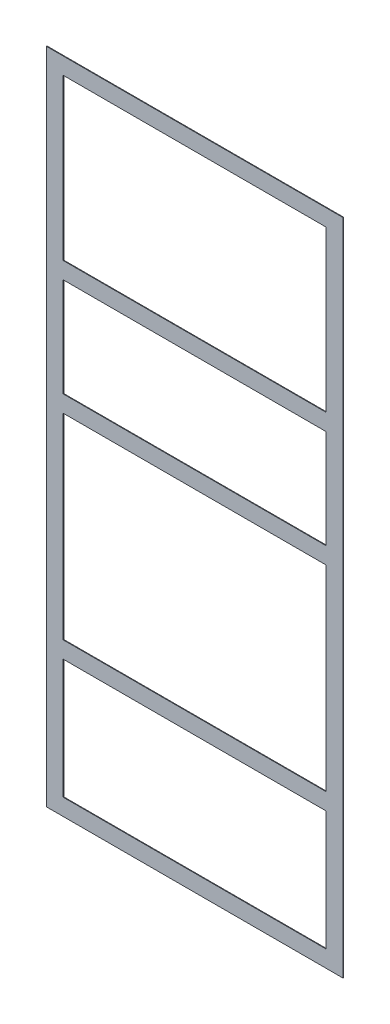
ISO-10303-21;
HEADER;
FILE_DESCRIPTION(('STEP AP214'),'2;1');
FILE_NAME('part.step','',(''),(''),'','','');
FILE_SCHEMA(('AUTOMOTIVE_DESIGN { 1 0 10303 214 1 1 1 1 }'));
ENDSEC;
DATA;
#1=APPLICATION_CONTEXT('core data for automotive mechanical design processes');
#2=APPLICATION_PROTOCOL_DEFINITION('international standard','automotive_design',2000,#1);
#3=PRODUCT_CONTEXT('',#1,'mechanical');
#4=PRODUCT('Part','Part','',(#3));
#5=PRODUCT_RELATED_PRODUCT_CATEGORY('part','',(#4));
#6=PRODUCT_DEFINITION_FORMATION('','',#4);
#7=PRODUCT_DEFINITION_CONTEXT('part definition',#1,'design');
#8=PRODUCT_DEFINITION('design','',#6,#7);
#9=PRODUCT_DEFINITION_SHAPE('','',#8);
#10=(LENGTH_UNIT() NAMED_UNIT(*) SI_UNIT(.MILLI.,.METRE.));
#11=(NAMED_UNIT(*) PLANE_ANGLE_UNIT() SI_UNIT($,.RADIAN.));
#12=(NAMED_UNIT(*) SI_UNIT($,.STERADIAN.) SOLID_ANGLE_UNIT());
#13=UNCERTAINTY_MEASURE_WITH_UNIT(LENGTH_MEASURE(1.E-05),#10,'distance_accuracy_value','');
#14=(GEOMETRIC_REPRESENTATION_CONTEXT(3) GLOBAL_UNCERTAINTY_ASSIGNED_CONTEXT((#13)) GLOBAL_UNIT_ASSIGNED_CONTEXT((#10,
#11,#12)) REPRESENTATION_CONTEXT('',''));
#15=CARTESIAN_POINT('',(0.,0.,0.));
#16=DIRECTION('',(0.,0.,1.));
#17=DIRECTION('',(1.,0.,0.));
#18=AXIS2_PLACEMENT_3D('',#15,#16,#17);
#19=CARTESIAN_POINT('',(0.,0.,1.9));
#20=DIRECTION('',(0.,0.,1.));
#21=DIRECTION('',(1.,0.,0.));
#22=AXIS2_PLACEMENT_3D('',#19,#20,#21);
#23=PLANE('',#22);
#24=DIRECTION('',(0.,-1.,0.));
#25=VECTOR('',#24,1.);
#26=CARTESIAN_POINT('',(-399.2,0.,1.9));
#27=LINE('',#26,#25);
#28=CARTESIAN_POINT('',(-399.2,60.5999999999998,1.9));
#29=VERTEX_POINT('',#28);
#30=CARTESIAN_POINT('',(-399.2,-535.4,1.9));
#31=VERTEX_POINT('',#30);
#32=EDGE_CURVE('E53',#29,#31,#27,.T.);
#33=ORIENTED_EDGE('',*,*,#32,.F.);
#34=DIRECTION('',(1.,0.,0.));
#35=VECTOR('',#34,1.);
#36=CARTESIAN_POINT('',(0.,60.5999999999998,1.9));
#37=LINE('',#36,#35);
#38=CARTESIAN_POINT('',(399.2,60.5999999999998,1.9));
#39=VERTEX_POINT('',#38);
#40=EDGE_CURVE('E195',#29,#39,#37,.T.);
#41=ORIENTED_EDGE('',*,*,#40,.T.);
#42=DIRECTION('',(0.,-1.,0.));
#43=VECTOR('',#42,1.);
#44=CARTESIAN_POINT('',(399.2,0.,1.9));
#45=LINE('',#44,#43);
#46=CARTESIAN_POINT('',(399.2,-535.4,1.9));
#47=VERTEX_POINT('',#46);
#48=EDGE_CURVE('E198',#39,#47,#45,.T.);
#49=ORIENTED_EDGE('',*,*,#48,.T.);
#50=DIRECTION('',(1.,0.,0.));
#51=VECTOR('',#50,1.);
#52=CARTESIAN_POINT('',(0.,-535.4,1.9));
#53=LINE('',#52,#51);
#54=EDGE_CURVE('E204',#31,#47,#53,.T.);
#55=ORIENTED_EDGE('',*,*,#54,.F.);
#56=EDGE_LOOP('',(#33,#41,#49,#55));
#57=FACE_BOUND('',#56,.T.);
#58=DIRECTION('',(0.,-1.,0.));
#59=VECTOR('',#58,1.);
#60=CARTESIAN_POINT('',(-399.2,0.,1.9));
#61=LINE('',#60,#59);
#62=CARTESIAN_POINT('',(-399.2,411.4,1.9));
#63=VERTEX_POINT('',#62);
#64=CARTESIAN_POINT('',(-399.2,111.4,1.9));
#65=VERTEX_POINT('',#64);
#66=EDGE_CURVE('E61',#63,#65,#61,.T.);
#67=ORIENTED_EDGE('',*,*,#66,.F.);
#68=DIRECTION('',(1.,0.,0.));
#69=VECTOR('',#68,1.);
#70=CARTESIAN_POINT('',(0.,411.4,1.9));
#71=LINE('',#70,#69);
#72=CARTESIAN_POINT('',(399.2,411.4,1.9));
#73=VERTEX_POINT('',#72);
#74=EDGE_CURVE('E219',#63,#73,#71,.T.);
#75=ORIENTED_EDGE('',*,*,#74,.T.);
#76=DIRECTION('',(0.,-1.,0.));
#77=VECTOR('',#76,1.);
#78=CARTESIAN_POINT('',(399.2,0.,1.9));
#79=LINE('',#78,#77);
#80=CARTESIAN_POINT('',(399.2,111.4,1.9));
#81=VERTEX_POINT('',#80);
#82=EDGE_CURVE('E233',#73,#81,#79,.T.);
#83=ORIENTED_EDGE('',*,*,#82,.T.);
#84=DIRECTION('',(1.,0.,0.));
#85=VECTOR('',#84,1.);
#86=CARTESIAN_POINT('',(0.,111.4,1.9));
#87=LINE('',#86,#85);
#88=EDGE_CURVE('E229',#65,#81,#87,.T.);
#89=ORIENTED_EDGE('',*,*,#88,.F.);
#90=EDGE_LOOP('',(#67,#75,#83,#89));
#91=FACE_BOUND('',#90,.T.);
#92=DIRECTION('',(0.,-1.,0.));
#93=VECTOR('',#92,1.);
#94=CARTESIAN_POINT('',(-399.2,0.,1.9));
#95=LINE('',#94,#93);
#96=CARTESIAN_POINT('',(-399.2,949.2,1.9));
#97=VERTEX_POINT('',#96);
#98=CARTESIAN_POINT('',(-399.2,462.2,1.9));
#99=VERTEX_POINT('',#98);
#100=EDGE_CURVE('E257',#97,#99,#95,.T.);
#101=ORIENTED_EDGE('',*,*,#100,.F.);
#102=DIRECTION('',(1.,0.,0.));
#103=VECTOR('',#102,1.);
#104=CARTESIAN_POINT('',(0.,949.2,1.9));
#105=LINE('',#104,#103);
#106=CARTESIAN_POINT('',(399.2,949.2,1.9));
#107=VERTEX_POINT('',#106);
#108=EDGE_CURVE('E248',#97,#107,#105,.T.);
#109=ORIENTED_EDGE('',*,*,#108,.T.);
#110=DIRECTION('',(0.,-1.,0.));
#111=VECTOR('',#110,1.);
#112=CARTESIAN_POINT('',(399.2,0.,1.9));
#113=LINE('',#112,#111);
#114=CARTESIAN_POINT('',(399.2,462.2,1.9));
#115=VERTEX_POINT('',#114);
#116=EDGE_CURVE('E262',#107,#115,#113,.T.);
#117=ORIENTED_EDGE('',*,*,#116,.T.);
#118=DIRECTION('',(1.,0.,0.));
#119=VECTOR('',#118,1.);
#120=CARTESIAN_POINT('',(0.,462.2,1.9));
#121=LINE('',#120,#119);
#122=EDGE_CURVE('E259',#99,#115,#121,.T.);
#123=ORIENTED_EDGE('',*,*,#122,.F.);
#124=EDGE_LOOP('',(#101,#109,#117,#123));
#125=FACE_BOUND('',#124,.T.);
#126=DIRECTION('',(0.,1.,0.));
#127=VECTOR('',#126,1.);
#128=CARTESIAN_POINT('',(450.,1000.,1.9));
#129=LINE('',#128,#127);
#130=CARTESIAN_POINT('',(450.,-1000.,1.9));
#131=VERTEX_POINT('',#130);
#132=CARTESIAN_POINT('',(450.,1000.,1.9));
#133=VERTEX_POINT('',#132);
#134=EDGE_CURVE('E306',#131,#133,#129,.T.);
#135=ORIENTED_EDGE('',*,*,#134,.T.);
#136=DIRECTION('',(-1.,0.,0.));
#137=VECTOR('',#136,1.);
#138=CARTESIAN_POINT('',(-450.,1000.,1.9));
#139=LINE('',#138,#137);
#140=CARTESIAN_POINT('',(-450.,1000.,1.9));
#141=VERTEX_POINT('',#140);
#142=EDGE_CURVE('E309',#133,#141,#139,.T.);
#143=ORIENTED_EDGE('',*,*,#142,.T.);
#144=DIRECTION('',(0.,-1.,0.));
#145=VECTOR('',#144,1.);
#146=CARTESIAN_POINT('',(-450.,1000.,1.9));
#147=LINE('',#146,#145);
#148=CARTESIAN_POINT('',(-450.,-1000.,1.9));
#149=VERTEX_POINT('',#148);
#150=EDGE_CURVE('E312',#141,#149,#147,.T.);
#151=ORIENTED_EDGE('',*,*,#150,.T.);
#152=DIRECTION('',(1.,0.,0.));
#153=VECTOR('',#152,1.);
#154=CARTESIAN_POINT('',(-450.,-1000.,1.9));
#155=LINE('',#154,#153);
#156=EDGE_CURVE('E314',#149,#131,#155,.T.);
#157=ORIENTED_EDGE('',*,*,#156,.T.);
#158=EDGE_LOOP('',(#135,#143,#151,#157));
#159=FACE_BOUND('',#158,.T.);
#160=DIRECTION('',(0.,-1.,0.));
#161=VECTOR('',#160,1.);
#162=CARTESIAN_POINT('',(-399.2,0.,1.9));
#163=LINE('',#162,#161);
#164=CARTESIAN_POINT('',(-399.2,-586.2,1.9));
#165=VERTEX_POINT('',#164);
#166=CARTESIAN_POINT('',(-399.2,-949.2,1.9));
#167=VERTEX_POINT('',#166);
#168=EDGE_CURVE('E288',#165,#167,#163,.T.);
#169=ORIENTED_EDGE('',*,*,#168,.F.);
#170=DIRECTION('',(1.,0.,0.));
#171=VECTOR('',#170,1.);
#172=CARTESIAN_POINT('',(0.,-586.2,1.9));
#173=LINE('',#172,#171);
#174=CARTESIAN_POINT('',(399.2,-586.2,1.9));
#175=VERTEX_POINT('',#174);
#176=EDGE_CURVE('E211',#165,#175,#173,.T.);
#177=ORIENTED_EDGE('',*,*,#176,.T.);
#178=DIRECTION('',(0.,-1.,0.));
#179=VECTOR('',#178,1.);
#180=CARTESIAN_POINT('',(399.2,0.,1.9));
#181=LINE('',#180,#179);
#182=CARTESIAN_POINT('',(399.2,-949.2,1.9));
#183=VERTEX_POINT('',#182);
#184=EDGE_CURVE('E277',#175,#183,#181,.T.);
#185=ORIENTED_EDGE('',*,*,#184,.T.);
#186=DIRECTION('',(1.,0.,0.));
#187=VECTOR('',#186,1.);
#188=CARTESIAN_POINT('',(0.,-949.2,1.9));
#189=LINE('',#188,#187);
#190=EDGE_CURVE('E291',#167,#183,#189,.T.);
#191=ORIENTED_EDGE('',*,*,#190,.F.);
#192=EDGE_LOOP('',(#169,#177,#185,#191));
#193=FACE_BOUND('',#192,.T.);
#194=ADVANCED_FACE('F38',(#57,#91,#125,#159,#193),#23,.T.);
#195=CARTESIAN_POINT('',(0.,0.,0.));
#196=DIRECTION('',(0.,0.,1.));
#197=DIRECTION('',(1.,0.,0.));
#198=AXIS2_PLACEMENT_3D('',#195,#196,#197);
#199=PLANE('',#198);
#200=DIRECTION('',(1.,0.,0.));
#201=VECTOR('',#200,1.);
#202=CARTESIAN_POINT('',(0.,60.5999999999998,0.));
#203=LINE('',#202,#201);
#204=CARTESIAN_POINT('',(-399.2,60.5999999999998,0.));
#205=VERTEX_POINT('',#204);
#206=CARTESIAN_POINT('',(399.2,60.5999999999998,0.));
#207=VERTEX_POINT('',#206);
#208=EDGE_CURVE('E183',#205,#207,#203,.T.);
#209=ORIENTED_EDGE('',*,*,#208,.F.);
#210=DIRECTION('',(0.,-1.,0.));
#211=VECTOR('',#210,1.);
#212=CARTESIAN_POINT('',(-399.2,0.,0.));
#213=LINE('',#212,#211);
#214=CARTESIAN_POINT('',(-399.2,-535.4,0.));
#215=VERTEX_POINT('',#214);
#216=EDGE_CURVE('E177',#205,#215,#213,.T.);
#217=ORIENTED_EDGE('',*,*,#216,.T.);
#218=DIRECTION('',(1.,0.,0.));
#219=VECTOR('',#218,1.);
#220=CARTESIAN_POINT('',(0.,-535.4,0.));
#221=LINE('',#220,#219);
#222=CARTESIAN_POINT('',(399.2,-535.4,0.));
#223=VERTEX_POINT('',#222);
#224=EDGE_CURVE('E186',#215,#223,#221,.T.);
#225=ORIENTED_EDGE('',*,*,#224,.T.);
#226=DIRECTION('',(0.,-1.,0.));
#227=VECTOR('',#226,1.);
#228=CARTESIAN_POINT('',(399.2,0.,0.));
#229=LINE('',#228,#227);
#230=EDGE_CURVE('E191',#207,#223,#229,.T.);
#231=ORIENTED_EDGE('',*,*,#230,.F.);
#232=EDGE_LOOP('',(#209,#217,#225,#231));
#233=FACE_BOUND('',#232,.T.);
#234=DIRECTION('',(1.,0.,0.));
#235=VECTOR('',#234,1.);
#236=CARTESIAN_POINT('',(0.,411.4,0.));
#237=LINE('',#236,#235);
#238=CARTESIAN_POINT('',(-399.2,411.4,0.));
#239=VERTEX_POINT('',#238);
#240=CARTESIAN_POINT('',(399.2,411.4,0.));
#241=VERTEX_POINT('',#240);
#242=EDGE_CURVE('E225',#239,#241,#237,.T.);
#243=ORIENTED_EDGE('',*,*,#242,.F.);
#244=DIRECTION('',(0.,-1.,0.));
#245=VECTOR('',#244,1.);
#246=CARTESIAN_POINT('',(-399.2,0.,0.));
#247=LINE('',#246,#245);
#248=CARTESIAN_POINT('',(-399.2,111.4,0.));
#249=VERTEX_POINT('',#248);
#250=EDGE_CURVE('E215',#239,#249,#247,.T.);
#251=ORIENTED_EDGE('',*,*,#250,.T.);
#252=DIRECTION('',(1.,0.,0.));
#253=VECTOR('',#252,1.);
#254=CARTESIAN_POINT('',(0.,111.4,0.));
#255=LINE('',#254,#253);
#256=CARTESIAN_POINT('',(399.2,111.4,0.));
#257=VERTEX_POINT('',#256);
#258=EDGE_CURVE('E218',#249,#257,#255,.T.);
#259=ORIENTED_EDGE('',*,*,#258,.T.);
#260=DIRECTION('',(0.,-1.,0.));
#261=VECTOR('',#260,1.);
#262=CARTESIAN_POINT('',(399.2,0.,0.));
#263=LINE('',#262,#261);
#264=EDGE_CURVE('E222',#241,#257,#263,.T.);
#265=ORIENTED_EDGE('',*,*,#264,.F.);
#266=EDGE_LOOP('',(#243,#251,#259,#265));
#267=FACE_BOUND('',#266,.T.);
#268=DIRECTION('',(1.,0.,0.));
#269=VECTOR('',#268,1.);
#270=CARTESIAN_POINT('',(0.,949.2,0.));
#271=LINE('',#270,#269);
#272=CARTESIAN_POINT('',(-399.2,949.2,0.));
#273=VERTEX_POINT('',#272);
#274=CARTESIAN_POINT('',(399.2,949.2,0.));
#275=VERTEX_POINT('',#274);
#276=EDGE_CURVE('E254',#273,#275,#271,.T.);
#277=ORIENTED_EDGE('',*,*,#276,.F.);
#278=DIRECTION('',(0.,-1.,0.));
#279=VECTOR('',#278,1.);
#280=CARTESIAN_POINT('',(-399.2,0.,0.));
#281=LINE('',#280,#279);
#282=CARTESIAN_POINT('',(-399.2,462.2,0.));
#283=VERTEX_POINT('',#282);
#284=EDGE_CURVE('E244',#273,#283,#281,.T.);
#285=ORIENTED_EDGE('',*,*,#284,.T.);
#286=DIRECTION('',(1.,0.,0.));
#287=VECTOR('',#286,1.);
#288=CARTESIAN_POINT('',(0.,462.2,0.));
#289=LINE('',#288,#287);
#290=CARTESIAN_POINT('',(399.2,462.2,0.));
#291=VERTEX_POINT('',#290);
#292=EDGE_CURVE('E247',#283,#291,#289,.T.);
#293=ORIENTED_EDGE('',*,*,#292,.T.);
#294=DIRECTION('',(0.,-1.,0.));
#295=VECTOR('',#294,1.);
#296=CARTESIAN_POINT('',(399.2,0.,0.));
#297=LINE('',#296,#295);
#298=EDGE_CURVE('E251',#275,#291,#297,.T.);
#299=ORIENTED_EDGE('',*,*,#298,.F.);
#300=EDGE_LOOP('',(#277,#285,#293,#299));
#301=FACE_BOUND('',#300,.T.);
#302=DIRECTION('',(0.,1.,0.));
#303=VECTOR('',#302,1.);
#304=CARTESIAN_POINT('',(450.,1000.,0.));
#305=LINE('',#304,#303);
#306=CARTESIAN_POINT('',(450.,-1000.,0.));
#307=VERTEX_POINT('',#306);
#308=CARTESIAN_POINT('',(450.,1000.,0.));
#309=VERTEX_POINT('',#308);
#310=EDGE_CURVE('E299',#307,#309,#305,.T.);
#311=ORIENTED_EDGE('',*,*,#310,.F.);
#312=DIRECTION('',(1.,0.,0.));
#313=VECTOR('',#312,1.);
#314=CARTESIAN_POINT('',(-450.,-1000.,0.));
#315=LINE('',#314,#313);
#316=CARTESIAN_POINT('',(-450.,-1000.,0.));
#317=VERTEX_POINT('',#316);
#318=EDGE_CURVE('E310',#317,#307,#315,.T.);
#319=ORIENTED_EDGE('',*,*,#318,.F.);
#320=DIRECTION('',(0.,-1.,0.));
#321=VECTOR('',#320,1.);
#322=CARTESIAN_POINT('',(-450.,1000.,0.));
#323=LINE('',#322,#321);
#324=CARTESIAN_POINT('',(-450.,1000.,0.));
#325=VERTEX_POINT('',#324);
#326=EDGE_CURVE('E321',#325,#317,#323,.T.);
#327=ORIENTED_EDGE('',*,*,#326,.F.);
#328=DIRECTION('',(-1.,0.,0.));
#329=VECTOR('',#328,1.);
#330=CARTESIAN_POINT('',(-450.,1000.,0.));
#331=LINE('',#330,#329);
#332=EDGE_CURVE('E319',#309,#325,#331,.T.);
#333=ORIENTED_EDGE('',*,*,#332,.F.);
#334=EDGE_LOOP('',(#311,#319,#327,#333));
#335=FACE_BOUND('',#334,.T.);
#336=DIRECTION('',(1.,0.,0.));
#337=VECTOR('',#336,1.);
#338=CARTESIAN_POINT('',(0.,-586.2,0.));
#339=LINE('',#338,#337);
#340=CARTESIAN_POINT('',(-399.2,-586.2,0.));
#341=VERTEX_POINT('',#340);
#342=CARTESIAN_POINT('',(399.2,-586.2,0.));
#343=VERTEX_POINT('',#342);
#344=EDGE_CURVE('E274',#341,#343,#339,.T.);
#345=ORIENTED_EDGE('',*,*,#344,.F.);
#346=DIRECTION('',(0.,-1.,0.));
#347=VECTOR('',#346,1.);
#348=CARTESIAN_POINT('',(-399.2,0.,0.));
#349=LINE('',#348,#347);
#350=CARTESIAN_POINT('',(-399.2,-949.2,0.));
#351=VERTEX_POINT('',#350);
#352=EDGE_CURVE('E276',#341,#351,#349,.T.);
#353=ORIENTED_EDGE('',*,*,#352,.T.);
#354=DIRECTION('',(1.,0.,0.));
#355=VECTOR('',#354,1.);
#356=CARTESIAN_POINT('',(0.,-949.2,0.));
#357=LINE('',#356,#355);
#358=CARTESIAN_POINT('',(399.2,-949.2,0.));
#359=VERTEX_POINT('',#358);
#360=EDGE_CURVE('E280',#351,#359,#357,.T.);
#361=ORIENTED_EDGE('',*,*,#360,.T.);
#362=DIRECTION('',(0.,-1.,0.));
#363=VECTOR('',#362,1.);
#364=CARTESIAN_POINT('',(399.2,0.,0.));
#365=LINE('',#364,#363);
#366=EDGE_CURVE('E283',#343,#359,#365,.T.);
#367=ORIENTED_EDGE('',*,*,#366,.F.);
#368=EDGE_LOOP('',(#345,#353,#361,#367));
#369=FACE_BOUND('',#368,.T.);
#370=ADVANCED_FACE('F193',(#233,#267,#301,#335,#369),#199,.F.);
#371=CARTESIAN_POINT('',(450.,1000.,1.9));
#372=DIRECTION('',(-1.,0.,0.));
#373=DIRECTION('',(0.,-1.,0.));
#374=AXIS2_PLACEMENT_3D('',#371,#372,#373);
#375=PLANE('',#374);
#376=ORIENTED_EDGE('',*,*,#310,.T.);
#377=DIRECTION('',(0.,0.,-1.));
#378=VECTOR('',#377,1.);
#379=CARTESIAN_POINT('',(450.,1000.,1.9));
#380=LINE('',#379,#378);
#381=EDGE_CURVE('E11',#133,#309,#380,.T.);
#382=ORIENTED_EDGE('',*,*,#381,.F.);
#383=ORIENTED_EDGE('',*,*,#134,.F.);
#384=DIRECTION('',(0.,0.,-1.));
#385=VECTOR('',#384,1.);
#386=CARTESIAN_POINT('',(450.,-1000.,1.9));
#387=LINE('',#386,#385);
#388=EDGE_CURVE('E316',#131,#307,#387,.T.);
#389=ORIENTED_EDGE('',*,*,#388,.T.);
#390=EDGE_LOOP('',(#376,#382,#383,#389));
#391=FACE_BOUND('',#390,.T.);
#392=ADVANCED_FACE('F40',(#391),#375,.F.);
#393=CARTESIAN_POINT('',(-450.,1000.,1.9));
#394=DIRECTION('',(0.,-1.,0.));
#395=DIRECTION('',(0.,0.,-1.));
#396=AXIS2_PLACEMENT_3D('',#393,#394,#395);
#397=PLANE('',#396);
#398=ORIENTED_EDGE('',*,*,#332,.T.);
#399=DIRECTION('',(0.,0.,-1.));
#400=VECTOR('',#399,1.);
#401=CARTESIAN_POINT('',(-450.,1000.,1.9));
#402=LINE('',#401,#400);
#403=EDGE_CURVE('E46',#141,#325,#402,.T.);
#404=ORIENTED_EDGE('',*,*,#403,.F.);
#405=ORIENTED_EDGE('',*,*,#142,.F.);
#406=ORIENTED_EDGE('',*,*,#381,.T.);
#407=EDGE_LOOP('',(#398,#404,#405,#406));
#408=FACE_BOUND('',#407,.T.);
#409=ADVANCED_FACE('F349',(#408),#397,.F.);
#410=CARTESIAN_POINT('',(-450.,1000.,1.9));
#411=DIRECTION('',(1.,0.,0.));
#412=DIRECTION('',(0.,1.,0.));
#413=AXIS2_PLACEMENT_3D('',#410,#411,#412);
#414=PLANE('',#413);
#415=ORIENTED_EDGE('',*,*,#326,.T.);
#416=DIRECTION('',(0.,0.,-1.));
#417=VECTOR('',#416,1.);
#418=CARTESIAN_POINT('',(-450.,-1000.,1.9));
#419=LINE('',#418,#417);
#420=EDGE_CURVE('E326',#149,#317,#419,.T.);
#421=ORIENTED_EDGE('',*,*,#420,.F.);
#422=ORIENTED_EDGE('',*,*,#150,.F.);
#423=ORIENTED_EDGE('',*,*,#403,.T.);
#424=EDGE_LOOP('',(#415,#421,#422,#423));
#425=FACE_BOUND('',#424,.T.);
#426=ADVANCED_FACE('F333',(#425),#414,.F.);
#427=CARTESIAN_POINT('',(-450.,-1000.,1.9));
#428=DIRECTION('',(0.,1.,0.));
#429=DIRECTION('',(0.,0.,1.));
#430=AXIS2_PLACEMENT_3D('',#427,#428,#429);
#431=PLANE('',#430);
#432=ORIENTED_EDGE('',*,*,#318,.T.);
#433=ORIENTED_EDGE('',*,*,#388,.F.);
#434=ORIENTED_EDGE('',*,*,#156,.F.);
#435=ORIENTED_EDGE('',*,*,#420,.T.);
#436=EDGE_LOOP('',(#432,#433,#434,#435));
#437=FACE_BOUND('',#436,.T.);
#438=ADVANCED_FACE('F342',(#437),#431,.F.);
#439=CARTESIAN_POINT('',(0.,-586.2,0.));
#440=DIRECTION('',(0.,-1.,0.));
#441=DIRECTION('',(0.,0.,-1.));
#442=AXIS2_PLACEMENT_3D('',#439,#440,#441);
#443=PLANE('',#442);
#444=ORIENTED_EDGE('',*,*,#176,.F.);
#445=DIRECTION('',(0.,0.,1.));
#446=VECTOR('',#445,1.);
#447=CARTESIAN_POINT('',(-399.2,-586.2,0.));
#448=LINE('',#447,#446);
#449=EDGE_CURVE('E285',#341,#165,#448,.T.);
#450=ORIENTED_EDGE('',*,*,#449,.F.);
#451=ORIENTED_EDGE('',*,*,#344,.T.);
#452=DIRECTION('',(0.,0.,1.));
#453=VECTOR('',#452,1.);
#454=CARTESIAN_POINT('',(399.2,-586.2,0.));
#455=LINE('',#454,#453);
#456=EDGE_CURVE('E296',#343,#175,#455,.T.);
#457=ORIENTED_EDGE('',*,*,#456,.T.);
#458=EDGE_LOOP('',(#444,#450,#451,#457));
#459=FACE_BOUND('',#458,.T.);
#460=ADVANCED_FACE('F365',(#459),#443,.T.);
#461=CARTESIAN_POINT('',(399.2,0.,0.));
#462=DIRECTION('',(-1.,0.,0.));
#463=DIRECTION('',(0.,0.,1.));
#464=AXIS2_PLACEMENT_3D('',#461,#462,#463);
#465=PLANE('',#464);
#466=ORIENTED_EDGE('',*,*,#184,.F.);
#467=ORIENTED_EDGE('',*,*,#456,.F.);
#468=ORIENTED_EDGE('',*,*,#366,.T.);
#469=DIRECTION('',(0.,0.,1.));
#470=VECTOR('',#469,1.);
#471=CARTESIAN_POINT('',(399.2,-949.2,0.));
#472=LINE('',#471,#470);
#473=EDGE_CURVE('E300',#359,#183,#472,.T.);
#474=ORIENTED_EDGE('',*,*,#473,.T.);
#475=EDGE_LOOP('',(#466,#467,#468,#474));
#476=FACE_BOUND('',#475,.T.);
#477=ADVANCED_FACE('F372',(#476),#465,.T.);
#478=CARTESIAN_POINT('',(0.,-949.2,0.));
#479=DIRECTION('',(0.,-1.,0.));
#480=DIRECTION('',(0.,0.,-1.));
#481=AXIS2_PLACEMENT_3D('',#478,#479,#480);
#482=PLANE('',#481);
#483=ORIENTED_EDGE('',*,*,#190,.T.);
#484=ORIENTED_EDGE('',*,*,#473,.F.);
#485=ORIENTED_EDGE('',*,*,#360,.F.);
#486=DIRECTION('',(0.,0.,1.));
#487=VECTOR('',#486,1.);
#488=CARTESIAN_POINT('',(-399.2,-949.2,0.));
#489=LINE('',#488,#487);
#490=EDGE_CURVE('E302',#351,#167,#489,.T.);
#491=ORIENTED_EDGE('',*,*,#490,.T.);
#492=EDGE_LOOP('',(#483,#484,#485,#491));
#493=FACE_BOUND('',#492,.T.);
#494=ADVANCED_FACE('F377',(#493),#482,.F.);
#495=CARTESIAN_POINT('',(-399.2,0.,0.));
#496=DIRECTION('',(-1.,0.,0.));
#497=DIRECTION('',(0.,0.,1.));
#498=AXIS2_PLACEMENT_3D('',#495,#496,#497);
#499=PLANE('',#498);
#500=ORIENTED_EDGE('',*,*,#168,.T.);
#501=ORIENTED_EDGE('',*,*,#490,.F.);
#502=ORIENTED_EDGE('',*,*,#352,.F.);
#503=ORIENTED_EDGE('',*,*,#449,.T.);
#504=EDGE_LOOP('',(#500,#501,#502,#503));
#505=FACE_BOUND('',#504,.T.);
#506=ADVANCED_FACE('F384',(#505),#499,.F.);
#507=CARTESIAN_POINT('',(-399.2,0.,0.));
#508=DIRECTION('',(-1.,0.,0.));
#509=DIRECTION('',(0.,0.,1.));
#510=AXIS2_PLACEMENT_3D('',#507,#508,#509);
#511=PLANE('',#510);
#512=ORIENTED_EDGE('',*,*,#100,.T.);
#513=DIRECTION('',(0.,0.,1.));
#514=VECTOR('',#513,1.);
#515=CARTESIAN_POINT('',(-399.2,462.2,0.));
#516=LINE('',#515,#514);
#517=EDGE_CURVE('E256',#283,#99,#516,.T.);
#518=ORIENTED_EDGE('',*,*,#517,.F.);
#519=ORIENTED_EDGE('',*,*,#284,.F.);
#520=DIRECTION('',(0.,0.,1.));
#521=VECTOR('',#520,1.);
#522=CARTESIAN_POINT('',(-399.2,949.2,0.));
#523=LINE('',#522,#521);
#524=EDGE_CURVE('E230',#273,#97,#523,.T.);
#525=ORIENTED_EDGE('',*,*,#524,.T.);
#526=EDGE_LOOP('',(#512,#518,#519,#525));
#527=FACE_BOUND('',#526,.T.);
#528=ADVANCED_FACE('F396',(#527),#511,.F.);
#529=CARTESIAN_POINT('',(0.,949.2,0.));
#530=DIRECTION('',(0.,-1.,0.));
#531=DIRECTION('',(0.,0.,-1.));
#532=AXIS2_PLACEMENT_3D('',#529,#530,#531);
#533=PLANE('',#532);
#534=ORIENTED_EDGE('',*,*,#108,.F.);
#535=ORIENTED_EDGE('',*,*,#524,.F.);
#536=ORIENTED_EDGE('',*,*,#276,.T.);
#537=DIRECTION('',(0.,0.,1.));
#538=VECTOR('',#537,1.);
#539=CARTESIAN_POINT('',(399.2,949.2,0.));
#540=LINE('',#539,#538);
#541=EDGE_CURVE('E268',#275,#107,#540,.T.);
#542=ORIENTED_EDGE('',*,*,#541,.T.);
#543=EDGE_LOOP('',(#534,#535,#536,#542));
#544=FACE_BOUND('',#543,.T.);
#545=ADVANCED_FACE('F400',(#544),#533,.T.);
#546=CARTESIAN_POINT('',(399.2,0.,0.));
#547=DIRECTION('',(-1.,0.,0.));
#548=DIRECTION('',(0.,0.,1.));
#549=AXIS2_PLACEMENT_3D('',#546,#547,#548);
#550=PLANE('',#549);
#551=ORIENTED_EDGE('',*,*,#116,.F.);
#552=ORIENTED_EDGE('',*,*,#541,.F.);
#553=ORIENTED_EDGE('',*,*,#298,.T.);
#554=DIRECTION('',(0.,0.,1.));
#555=VECTOR('',#554,1.);
#556=CARTESIAN_POINT('',(399.2,462.2,0.));
#557=LINE('',#556,#555);
#558=EDGE_CURVE('E270',#291,#115,#557,.T.);
#559=ORIENTED_EDGE('',*,*,#558,.T.);
#560=EDGE_LOOP('',(#551,#552,#553,#559));
#561=FACE_BOUND('',#560,.T.);
#562=ADVANCED_FACE('F406',(#561),#550,.T.);
#563=CARTESIAN_POINT('',(0.,462.2,0.));
#564=DIRECTION('',(0.,-1.,0.));
#565=DIRECTION('',(0.,0.,-1.));
#566=AXIS2_PLACEMENT_3D('',#563,#564,#565);
#567=PLANE('',#566);
#568=ORIENTED_EDGE('',*,*,#122,.T.);
#569=ORIENTED_EDGE('',*,*,#558,.F.);
#570=ORIENTED_EDGE('',*,*,#292,.F.);
#571=ORIENTED_EDGE('',*,*,#517,.T.);
#572=EDGE_LOOP('',(#568,#569,#570,#571));
#573=FACE_BOUND('',#572,.T.);
#574=ADVANCED_FACE('F402',(#573),#567,.F.);
#575=CARTESIAN_POINT('',(-399.2,0.,0.));
#576=DIRECTION('',(-1.,0.,0.));
#577=DIRECTION('',(0.,0.,1.));
#578=AXIS2_PLACEMENT_3D('',#575,#576,#577);
#579=PLANE('',#578);
#580=ORIENTED_EDGE('',*,*,#66,.T.);
#581=DIRECTION('',(0.,0.,1.));
#582=VECTOR('',#581,1.);
#583=CARTESIAN_POINT('',(-399.2,111.4,0.));
#584=LINE('',#583,#582);
#585=EDGE_CURVE('E227',#249,#65,#584,.T.);
#586=ORIENTED_EDGE('',*,*,#585,.F.);
#587=ORIENTED_EDGE('',*,*,#250,.F.);
#588=DIRECTION('',(0.,0.,1.));
#589=VECTOR('',#588,1.);
#590=CARTESIAN_POINT('',(-399.2,411.4,0.));
#591=LINE('',#590,#589);
#592=EDGE_CURVE('E205',#239,#63,#591,.T.);
#593=ORIENTED_EDGE('',*,*,#592,.T.);
#594=EDGE_LOOP('',(#580,#586,#587,#593));
#595=FACE_BOUND('',#594,.T.);
#596=ADVANCED_FACE('F405',(#595),#579,.F.);
#597=CARTESIAN_POINT('',(0.,411.4,0.));
#598=DIRECTION('',(0.,-1.,0.));
#599=DIRECTION('',(1.,0.,0.));
#600=AXIS2_PLACEMENT_3D('',#597,#598,#599);
#601=PLANE('',#600);
#602=ORIENTED_EDGE('',*,*,#74,.F.);
#603=ORIENTED_EDGE('',*,*,#592,.F.);
#604=ORIENTED_EDGE('',*,*,#242,.T.);
#605=DIRECTION('',(0.,0.,1.));
#606=VECTOR('',#605,1.);
#607=CARTESIAN_POINT('',(399.2,411.4,0.));
#608=LINE('',#607,#606);
#609=EDGE_CURVE('E239',#241,#73,#608,.T.);
#610=ORIENTED_EDGE('',*,*,#609,.T.);
#611=EDGE_LOOP('',(#602,#603,#604,#610));
#612=FACE_BOUND('',#611,.T.);
#613=ADVANCED_FACE('F416',(#612),#601,.T.);
#614=CARTESIAN_POINT('',(399.2,0.,0.));
#615=DIRECTION('',(-1.,0.,0.));
#616=DIRECTION('',(0.,0.,1.));
#617=AXIS2_PLACEMENT_3D('',#614,#615,#616);
#618=PLANE('',#617);
#619=ORIENTED_EDGE('',*,*,#82,.F.);
#620=ORIENTED_EDGE('',*,*,#609,.F.);
#621=ORIENTED_EDGE('',*,*,#264,.T.);
#622=DIRECTION('',(0.,0.,1.));
#623=VECTOR('',#622,1.);
#624=CARTESIAN_POINT('',(399.2,111.4,0.));
#625=LINE('',#624,#623);
#626=EDGE_CURVE('E241',#257,#81,#625,.T.);
#627=ORIENTED_EDGE('',*,*,#626,.T.);
#628=EDGE_LOOP('',(#619,#620,#621,#627));
#629=FACE_BOUND('',#628,.T.);
#630=ADVANCED_FACE('F420',(#629),#618,.T.);
#631=CARTESIAN_POINT('',(0.,111.4,0.));
#632=DIRECTION('',(0.,-1.,0.));
#633=DIRECTION('',(1.,0.,0.));
#634=AXIS2_PLACEMENT_3D('',#631,#632,#633);
#635=PLANE('',#634);
#636=ORIENTED_EDGE('',*,*,#88,.T.);
#637=ORIENTED_EDGE('',*,*,#626,.F.);
#638=ORIENTED_EDGE('',*,*,#258,.F.);
#639=ORIENTED_EDGE('',*,*,#585,.T.);
#640=EDGE_LOOP('',(#636,#637,#638,#639));
#641=FACE_BOUND('',#640,.T.);
#642=ADVANCED_FACE('F417',(#641),#635,.F.);
#643=CARTESIAN_POINT('',(-399.2,0.,0.));
#644=DIRECTION('',(-1.,0.,0.));
#645=DIRECTION('',(0.,0.,1.));
#646=AXIS2_PLACEMENT_3D('',#643,#644,#645);
#647=PLANE('',#646);
#648=ORIENTED_EDGE('',*,*,#32,.T.);
#649=DIRECTION('',(0.,0.,1.));
#650=VECTOR('',#649,1.);
#651=CARTESIAN_POINT('',(-399.2,-535.4,0.));
#652=LINE('',#651,#650);
#653=EDGE_CURVE('E173',#215,#31,#652,.T.);
#654=ORIENTED_EDGE('',*,*,#653,.F.);
#655=ORIENTED_EDGE('',*,*,#216,.F.);
#656=DIRECTION('',(0.,0.,1.));
#657=VECTOR('',#656,1.);
#658=CARTESIAN_POINT('',(-399.2,60.5999999999998,0.));
#659=LINE('',#658,#657);
#660=EDGE_CURVE('E209',#205,#29,#659,.T.);
#661=ORIENTED_EDGE('',*,*,#660,.T.);
#662=EDGE_LOOP('',(#648,#654,#655,#661));
#663=FACE_BOUND('',#662,.T.);
#664=ADVANCED_FACE('F175',(#663),#647,.F.);
#665=CARTESIAN_POINT('',(0.,60.5999999999998,0.));
#666=DIRECTION('',(0.,-1.,0.));
#667=DIRECTION('',(1.,0.,0.));
#668=AXIS2_PLACEMENT_3D('',#665,#666,#667);
#669=PLANE('',#668);
#670=ORIENTED_EDGE('',*,*,#40,.F.);
#671=ORIENTED_EDGE('',*,*,#660,.F.);
#672=ORIENTED_EDGE('',*,*,#208,.T.);
#673=DIRECTION('',(0.,0.,1.));
#674=VECTOR('',#673,1.);
#675=CARTESIAN_POINT('',(399.2,60.5999999999998,0.));
#676=LINE('',#675,#674);
#677=EDGE_CURVE('E212',#207,#39,#676,.T.);
#678=ORIENTED_EDGE('',*,*,#677,.T.);
#679=EDGE_LOOP('',(#670,#671,#672,#678));
#680=FACE_BOUND('',#679,.T.);
#681=ADVANCED_FACE('F430',(#680),#669,.T.);
#682=CARTESIAN_POINT('',(399.2,0.,0.));
#683=DIRECTION('',(-1.,0.,0.));
#684=DIRECTION('',(0.,0.,1.));
#685=AXIS2_PLACEMENT_3D('',#682,#683,#684);
#686=PLANE('',#685);
#687=ORIENTED_EDGE('',*,*,#48,.F.);
#688=ORIENTED_EDGE('',*,*,#677,.F.);
#689=ORIENTED_EDGE('',*,*,#230,.T.);
#690=DIRECTION('',(0.,0.,1.));
#691=VECTOR('',#690,1.);
#692=CARTESIAN_POINT('',(399.2,-535.4,0.));
#693=LINE('',#692,#691);
#694=EDGE_CURVE('E182',#223,#47,#693,.T.);
#695=ORIENTED_EDGE('',*,*,#694,.T.);
#696=EDGE_LOOP('',(#687,#688,#689,#695));
#697=FACE_BOUND('',#696,.T.);
#698=ADVANCED_FACE('F433',(#697),#686,.T.);
#699=CARTESIAN_POINT('',(0.,-535.4,0.));
#700=DIRECTION('',(0.,-1.,0.));
#701=DIRECTION('',(0.,0.,-1.));
#702=AXIS2_PLACEMENT_3D('',#699,#700,#701);
#703=PLANE('',#702);
#704=ORIENTED_EDGE('',*,*,#54,.T.);
#705=ORIENTED_EDGE('',*,*,#694,.F.);
#706=ORIENTED_EDGE('',*,*,#224,.F.);
#707=ORIENTED_EDGE('',*,*,#653,.T.);
#708=EDGE_LOOP('',(#704,#705,#706,#707));
#709=FACE_BOUND('',#708,.T.);
#710=ADVANCED_FACE('F187',(#709),#703,.F.);
#711=CLOSED_SHELL('',(#194,#370,#392,#409,#426,#438,#460,#477,#494,#506,#528,#545,#562,#574,
#596,#613,#630,#642,#664,#681,#698,#710));
#712=MANIFOLD_SOLID_BREP('B2',#711);
#713=ADVANCED_BREP_SHAPE_REPRESENTATION('',(#18,#712),#14);
#714=SHAPE_DEFINITION_REPRESENTATION(#9,#713);
ENDSEC;
END-ISO-10303-21;
